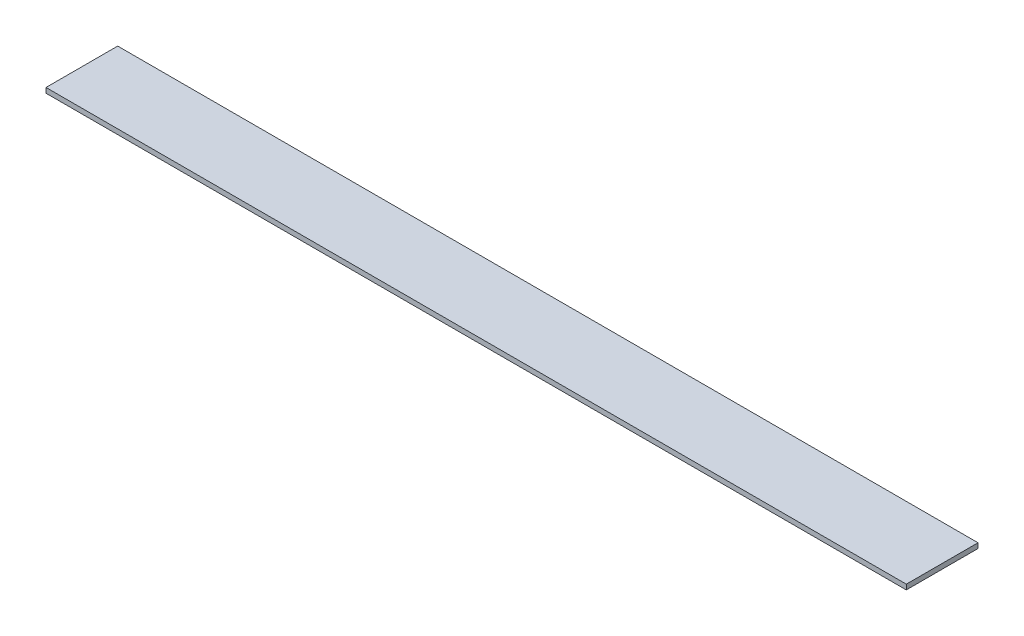
ISO-10303-21;
HEADER;
FILE_DESCRIPTION(('STEP AP214'),'2;1');
FILE_NAME('part.step','',(''),(''),'','','');
FILE_SCHEMA(('AUTOMOTIVE_DESIGN { 1 0 10303 214 1 1 1 1 }'));
ENDSEC;
DATA;
#1=APPLICATION_CONTEXT('core data for automotive mechanical design processes');
#2=APPLICATION_PROTOCOL_DEFINITION('international standard','automotive_design',2000,#1);
#3=PRODUCT_CONTEXT('',#1,'mechanical');
#4=PRODUCT('Part','Part','',(#3));
#5=PRODUCT_RELATED_PRODUCT_CATEGORY('part','',(#4));
#6=PRODUCT_DEFINITION_FORMATION('','',#4);
#7=PRODUCT_DEFINITION_CONTEXT('part definition',#1,'design');
#8=PRODUCT_DEFINITION('design','',#6,#7);
#9=PRODUCT_DEFINITION_SHAPE('','',#8);
#10=(LENGTH_UNIT() NAMED_UNIT(*) SI_UNIT(.MILLI.,.METRE.));
#11=(NAMED_UNIT(*) PLANE_ANGLE_UNIT() SI_UNIT($,.RADIAN.));
#12=(NAMED_UNIT(*) SI_UNIT($,.STERADIAN.) SOLID_ANGLE_UNIT());
#13=UNCERTAINTY_MEASURE_WITH_UNIT(LENGTH_MEASURE(1.E-05),#10,'distance_accuracy_value','');
#14=(GEOMETRIC_REPRESENTATION_CONTEXT(3) GLOBAL_UNCERTAINTY_ASSIGNED_CONTEXT((#13)) GLOBAL_UNIT_ASSIGNED_CONTEXT((#10,
#11,#12)) REPRESENTATION_CONTEXT('',''));
#15=CARTESIAN_POINT('',(0.,0.,0.));
#16=DIRECTION('',(0.,0.,1.));
#17=DIRECTION('',(1.,0.,0.));
#18=AXIS2_PLACEMENT_3D('',#15,#16,#17);
#19=CARTESIAN_POINT('',(60.,0.7,5.));
#20=DIRECTION('',(-1.,0.,0.));
#21=DIRECTION('',(0.,0.,1.));
#22=AXIS2_PLACEMENT_3D('',#19,#20,#21);
#23=PLANE('',#22);
#24=DIRECTION('',(0.,0.,-1.));
#25=VECTOR('',#24,1.);
#26=CARTESIAN_POINT('',(60.,0.,5.));
#27=LINE('',#26,#25);
#28=CARTESIAN_POINT('',(60.,0.,5.));
#29=VERTEX_POINT('',#28);
#30=CARTESIAN_POINT('',(60.,0.,-5.));
#31=VERTEX_POINT('',#30);
#32=EDGE_CURVE('E96',#29,#31,#27,.T.);
#33=ORIENTED_EDGE('',*,*,#32,.T.);
#34=DIRECTION('',(0.,-1.,0.));
#35=VECTOR('',#34,1.);
#36=CARTESIAN_POINT('',(60.,0.7,-5.));
#37=LINE('',#36,#35);
#38=CARTESIAN_POINT('',(60.,0.7,-5.));
#39=VERTEX_POINT('',#38);
#40=EDGE_CURVE('E11',#39,#31,#37,.T.);
#41=ORIENTED_EDGE('',*,*,#40,.F.);
#42=DIRECTION('',(0.,0.,-1.));
#43=VECTOR('',#42,1.);
#44=CARTESIAN_POINT('',(60.,0.7,5.));
#45=LINE('',#44,#43);
#46=CARTESIAN_POINT('',(60.,0.7,5.));
#47=VERTEX_POINT('',#46);
#48=EDGE_CURVE('E84',#47,#39,#45,.T.);
#49=ORIENTED_EDGE('',*,*,#48,.F.);
#50=DIRECTION('',(0.,-1.,0.));
#51=VECTOR('',#50,1.);
#52=CARTESIAN_POINT('',(60.,0.7,5.));
#53=LINE('',#52,#51);
#54=EDGE_CURVE('E92',#47,#29,#53,.T.);
#55=ORIENTED_EDGE('',*,*,#54,.T.);
#56=EDGE_LOOP('',(#33,#41,#49,#55));
#57=FACE_BOUND('',#56,.T.);
#58=ADVANCED_FACE('F33',(#57),#23,.F.);
#59=CARTESIAN_POINT('',(-60.,0.7,-5.));
#60=DIRECTION('',(0.,0.,1.));
#61=DIRECTION('',(1.,0.,0.));
#62=AXIS2_PLACEMENT_3D('',#59,#60,#61);
#63=PLANE('',#62);
#64=DIRECTION('',(-1.,0.,0.));
#65=VECTOR('',#64,1.);
#66=CARTESIAN_POINT('',(-60.,0.,-5.));
#67=LINE('',#66,#65);
#68=CARTESIAN_POINT('',(-60.,0.,-5.));
#69=VERTEX_POINT('',#68);
#70=EDGE_CURVE('E88',#31,#69,#67,.T.);
#71=ORIENTED_EDGE('',*,*,#70,.T.);
#72=DIRECTION('',(0.,-1.,0.));
#73=VECTOR('',#72,1.);
#74=CARTESIAN_POINT('',(-60.,0.7,-5.));
#75=LINE('',#74,#73);
#76=CARTESIAN_POINT('',(-60.,0.7,-5.));
#77=VERTEX_POINT('',#76);
#78=EDGE_CURVE('E41',#77,#69,#75,.T.);
#79=ORIENTED_EDGE('',*,*,#78,.F.);
#80=DIRECTION('',(-1.,0.,0.));
#81=VECTOR('',#80,1.);
#82=CARTESIAN_POINT('',(-60.,0.7,-5.));
#83=LINE('',#82,#81);
#84=EDGE_CURVE('E79',#39,#77,#83,.T.);
#85=ORIENTED_EDGE('',*,*,#84,.F.);
#86=ORIENTED_EDGE('',*,*,#40,.T.);
#87=EDGE_LOOP('',(#71,#79,#85,#86));
#88=FACE_BOUND('',#87,.T.);
#89=ADVANCED_FACE('F87',(#88),#63,.F.);
#90=CARTESIAN_POINT('',(-60.,0.7,5.));
#91=DIRECTION('',(1.,0.,0.));
#92=DIRECTION('',(0.,0.,-1.));
#93=AXIS2_PLACEMENT_3D('',#90,#91,#92);
#94=PLANE('',#93);
#95=DIRECTION('',(0.,0.,1.));
#96=VECTOR('',#95,1.);
#97=CARTESIAN_POINT('',(-60.,0.,5.));
#98=LINE('',#97,#96);
#99=CARTESIAN_POINT('',(-60.,0.,5.));
#100=VERTEX_POINT('',#99);
#101=EDGE_CURVE('E66',#69,#100,#98,.T.);
#102=ORIENTED_EDGE('',*,*,#101,.T.);
#103=DIRECTION('',(0.,-1.,0.));
#104=VECTOR('',#103,1.);
#105=CARTESIAN_POINT('',(-60.,0.7,5.));
#106=LINE('',#105,#104);
#107=CARTESIAN_POINT('',(-60.,0.7,5.));
#108=VERTEX_POINT('',#107);
#109=EDGE_CURVE('E89',#108,#100,#106,.T.);
#110=ORIENTED_EDGE('',*,*,#109,.F.);
#111=DIRECTION('',(0.,0.,1.));
#112=VECTOR('',#111,1.);
#113=CARTESIAN_POINT('',(-60.,0.7,5.));
#114=LINE('',#113,#112);
#115=EDGE_CURVE('E82',#77,#108,#114,.T.);
#116=ORIENTED_EDGE('',*,*,#115,.F.);
#117=ORIENTED_EDGE('',*,*,#78,.T.);
#118=EDGE_LOOP('',(#102,#110,#116,#117));
#119=FACE_BOUND('',#118,.T.);
#120=ADVANCED_FACE('F90',(#119),#94,.F.);
#121=CARTESIAN_POINT('',(-60.,0.7,5.));
#122=DIRECTION('',(0.,0.,-1.));
#123=DIRECTION('',(-1.,0.,0.));
#124=AXIS2_PLACEMENT_3D('',#121,#122,#123);
#125=PLANE('',#124);
#126=DIRECTION('',(1.,0.,0.));
#127=VECTOR('',#126,1.);
#128=CARTESIAN_POINT('',(-60.,0.,5.));
#129=LINE('',#128,#127);
#130=EDGE_CURVE('E72',#100,#29,#129,.T.);
#131=ORIENTED_EDGE('',*,*,#130,.T.);
#132=ORIENTED_EDGE('',*,*,#54,.F.);
#133=DIRECTION('',(1.,0.,0.));
#134=VECTOR('',#133,1.);
#135=CARTESIAN_POINT('',(-60.,0.7,5.));
#136=LINE('',#135,#134);
#137=EDGE_CURVE('E49',#108,#47,#136,.T.);
#138=ORIENTED_EDGE('',*,*,#137,.F.);
#139=ORIENTED_EDGE('',*,*,#109,.T.);
#140=EDGE_LOOP('',(#131,#132,#138,#139));
#141=FACE_BOUND('',#140,.T.);
#142=ADVANCED_FACE('F103',(#141),#125,.F.);
#143=CARTESIAN_POINT('',(0.,0.7,0.));
#144=DIRECTION('',(0.,-1.,0.));
#145=DIRECTION('',(0.,0.,-1.));
#146=AXIS2_PLACEMENT_3D('',#143,#144,#145);
#147=PLANE('',#146);
#148=ORIENTED_EDGE('',*,*,#48,.T.);
#149=ORIENTED_EDGE('',*,*,#84,.T.);
#150=ORIENTED_EDGE('',*,*,#115,.T.);
#151=ORIENTED_EDGE('',*,*,#137,.T.);
#152=EDGE_LOOP('',(#148,#149,#150,#151));
#153=FACE_BOUND('',#152,.T.);
#154=ADVANCED_FACE('F80',(#153),#147,.F.);
#155=CARTESIAN_POINT('',(0.,0.,0.));
#156=DIRECTION('',(0.,-1.,0.));
#157=DIRECTION('',(0.,0.,-1.));
#158=AXIS2_PLACEMENT_3D('',#155,#156,#157);
#159=PLANE('',#158);
#160=ORIENTED_EDGE('',*,*,#32,.F.);
#161=ORIENTED_EDGE('',*,*,#130,.F.);
#162=ORIENTED_EDGE('',*,*,#101,.F.);
#163=ORIENTED_EDGE('',*,*,#70,.F.);
#164=EDGE_LOOP('',(#160,#161,#162,#163));
#165=FACE_BOUND('',#164,.T.);
#166=ADVANCED_FACE('F106',(#165),#159,.T.);
#167=CLOSED_SHELL('',(#58,#89,#120,#142,#154,#166));
#168=MANIFOLD_SOLID_BREP('B2',#167);
#169=ADVANCED_BREP_SHAPE_REPRESENTATION('',(#18,#168),#14);
#170=SHAPE_DEFINITION_REPRESENTATION(#9,#169);
ENDSEC;
END-ISO-10303-21;
